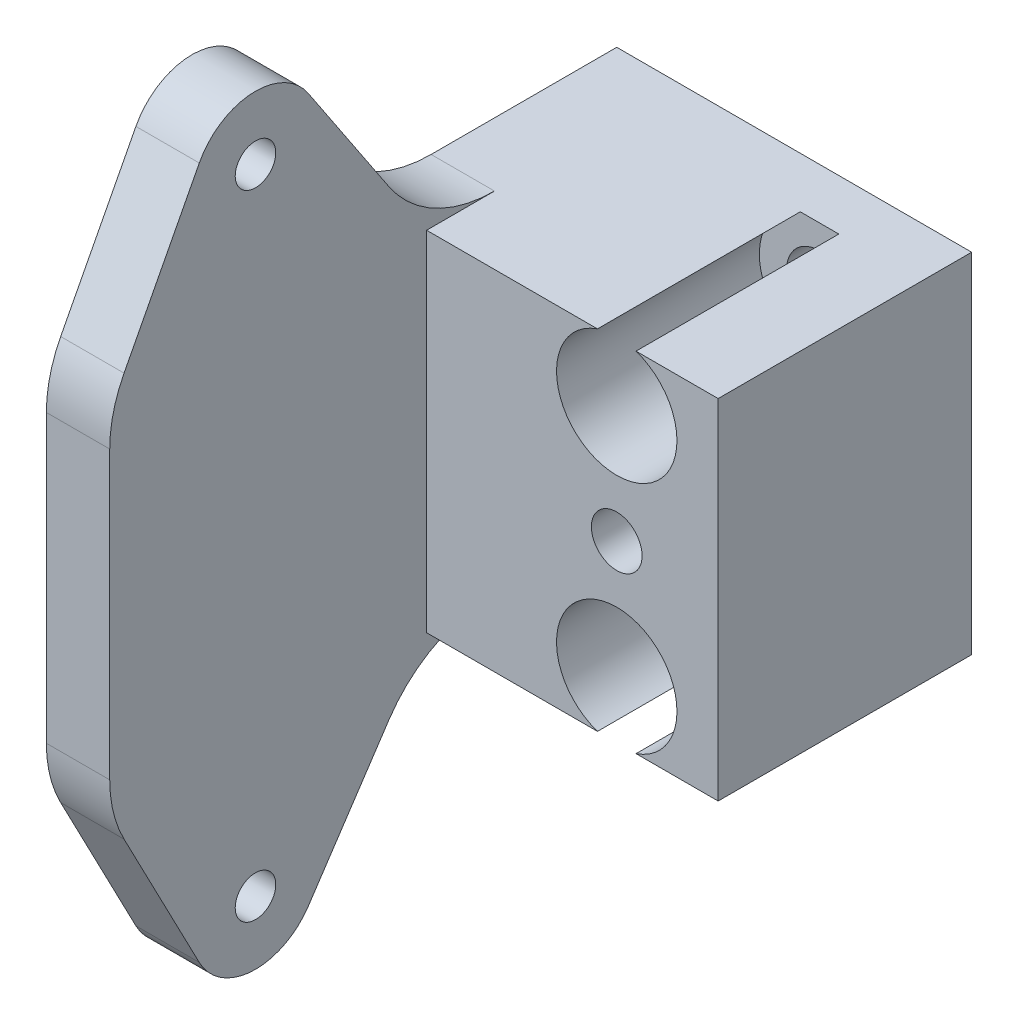
ISO-10303-21;
HEADER;
FILE_DESCRIPTION(('STEP AP214'),'2;1');
FILE_NAME('part.step','',(''),(''),'','','');
FILE_SCHEMA(('AUTOMOTIVE_DESIGN { 1 0 10303 214 1 1 1 1 }'));
ENDSEC;
DATA;
#1=APPLICATION_CONTEXT('core data for automotive mechanical design processes');
#2=APPLICATION_PROTOCOL_DEFINITION('international standard','automotive_design',2000,#1);
#3=PRODUCT_CONTEXT('',#1,'mechanical');
#4=PRODUCT('Part','Part','',(#3));
#5=PRODUCT_RELATED_PRODUCT_CATEGORY('part','',(#4));
#6=PRODUCT_DEFINITION_FORMATION('','',#4);
#7=PRODUCT_DEFINITION_CONTEXT('part definition',#1,'design');
#8=PRODUCT_DEFINITION('design','',#6,#7);
#9=PRODUCT_DEFINITION_SHAPE('','',#8);
#10=(LENGTH_UNIT() NAMED_UNIT(*) SI_UNIT(.MILLI.,.METRE.));
#11=(NAMED_UNIT(*) PLANE_ANGLE_UNIT() SI_UNIT($,.RADIAN.));
#12=(NAMED_UNIT(*) SI_UNIT($,.STERADIAN.) SOLID_ANGLE_UNIT());
#13=UNCERTAINTY_MEASURE_WITH_UNIT(LENGTH_MEASURE(1.E-05),#10,'distance_accuracy_value','');
#14=(GEOMETRIC_REPRESENTATION_CONTEXT(3) GLOBAL_UNCERTAINTY_ASSIGNED_CONTEXT((#13)) GLOBAL_UNIT_ASSIGNED_CONTEXT((#10,
#11,#12)) REPRESENTATION_CONTEXT('',''));
#15=CARTESIAN_POINT('',(0.,0.,0.));
#16=DIRECTION('',(0.,0.,1.));
#17=DIRECTION('',(1.,0.,0.));
#18=AXIS2_PLACEMENT_3D('',#15,#16,#17);
#19=CARTESIAN_POINT('',(0.,9.25,20.));
#20=DIRECTION('',(0.,0.,-1.));
#21=DIRECTION('',(-1.,0.,0.));
#22=AXIS2_PLACEMENT_3D('',#19,#20,#21);
#23=CYLINDRICAL_SURFACE('',#22,2.6);
#24=CARTESIAN_POINT('',(0.,9.25,0.));
#25=DIRECTION('',(0.,0.,1.));
#26=DIRECTION('',(1.,0.,0.));
#27=AXIS2_PLACEMENT_3D('',#24,#25,#26);
#28=CIRCLE('',#27,2.6);
#29=CARTESIAN_POINT('',(2.59999999999998,9.25,0.));
#30=VERTEX_POINT('',#29);
#31=EDGE_CURVE('E186',#30,#30,#28,.T.);
#32=ORIENTED_EDGE('',*,*,#31,.F.);
#33=EDGE_LOOP('',(#32));
#34=FACE_BOUND('',#33,.T.);
#35=CARTESIAN_POINT('',(0.,9.25,4.));
#36=DIRECTION('',(0.,0.,1.));
#37=DIRECTION('',(1.,0.,0.));
#38=AXIS2_PLACEMENT_3D('',#35,#36,#37);
#39=CIRCLE('',#38,2.6);
#40=CARTESIAN_POINT('',(2.59999999999998,9.25,4.));
#41=VERTEX_POINT('',#40);
#42=EDGE_CURVE('E263',#41,#41,#39,.T.);
#43=ORIENTED_EDGE('',*,*,#42,.T.);
#44=EDGE_LOOP('',(#43));
#45=FACE_BOUND('',#44,.T.);
#46=ADVANCED_FACE('F36',(#34,#45),#23,.F.);
#47=CARTESIAN_POINT('',(0.,-9.25,20.));
#48=DIRECTION('',(0.,0.,-1.));
#49=DIRECTION('',(-1.,0.,0.));
#50=AXIS2_PLACEMENT_3D('',#47,#48,#49);
#51=CYLINDRICAL_SURFACE('',#50,2.6);
#52=CARTESIAN_POINT('',(0.,-9.25,0.));
#53=DIRECTION('',(0.,0.,1.));
#54=DIRECTION('',(-1.,0.,0.));
#55=AXIS2_PLACEMENT_3D('',#52,#53,#54);
#56=CIRCLE('',#55,2.6);
#57=CARTESIAN_POINT('',(-2.60000000000002,-9.25,0.));
#58=VERTEX_POINT('',#57);
#59=EDGE_CURVE('E270',#58,#58,#56,.T.);
#60=ORIENTED_EDGE('',*,*,#59,.F.);
#61=EDGE_LOOP('',(#60));
#62=FACE_BOUND('',#61,.T.);
#63=CARTESIAN_POINT('',(0.,-9.25,4.));
#64=DIRECTION('',(0.,0.,1.));
#65=DIRECTION('',(1.,0.,0.));
#66=AXIS2_PLACEMENT_3D('',#63,#64,#65);
#67=CIRCLE('',#66,2.6);
#68=CARTESIAN_POINT('',(2.59999999999998,-9.25,4.));
#69=VERTEX_POINT('',#68);
#70=EDGE_CURVE('E255',#69,#69,#67,.T.);
#71=ORIENTED_EDGE('',*,*,#70,.T.);
#72=EDGE_LOOP('',(#71));
#73=FACE_BOUND('',#72,.T.);
#74=ADVANCED_FACE('F396',(#62,#73),#51,.F.);
#75=CARTESIAN_POINT('',(0.,0.,20.));
#76=DIRECTION('',(0.,0.,1.));
#77=DIRECTION('',(1.,0.,0.));
#78=AXIS2_PLACEMENT_3D('',#75,#76,#77);
#79=PLANE('',#78);
#80=CARTESIAN_POINT('',(0.,9.25,20.));
#81=DIRECTION('',(0.,0.,1.));
#82=DIRECTION('',(1.,0.,0.));
#83=AXIS2_PLACEMENT_3D('',#80,#81,#82);
#84=CIRCLE('',#83,4.75);
#85=CARTESIAN_POINT('',(-1.52069063257457,13.75,20.));
#86=VERTEX_POINT('',#85);
#87=CARTESIAN_POINT('',(1.52069063257452,13.75,20.));
#88=VERTEX_POINT('',#87);
#89=EDGE_CURVE('E256',#86,#88,#84,.T.);
#90=ORIENTED_EDGE('',*,*,#89,.F.);
#91=DIRECTION('',(-1.,0.,0.));
#92=VECTOR('',#91,1.);
#93=CARTESIAN_POINT('',(8.,13.75,20.));
#94=LINE('',#93,#92);
#95=CARTESIAN_POINT('',(-15.,13.75,20.));
#96=VERTEX_POINT('',#95);
#97=EDGE_CURVE('E287',#86,#96,#94,.T.);
#98=ORIENTED_EDGE('',*,*,#97,.T.);
#99=DIRECTION('',(0.,-1.,0.));
#100=VECTOR('',#99,1.);
#101=CARTESIAN_POINT('',(-15.,-13.75,20.));
#102=LINE('',#101,#100);
#103=CARTESIAN_POINT('',(-15.,-13.75,20.));
#104=VERTEX_POINT('',#103);
#105=EDGE_CURVE('E277',#96,#104,#102,.T.);
#106=ORIENTED_EDGE('',*,*,#105,.T.);
#107=DIRECTION('',(1.,0.,0.));
#108=VECTOR('',#107,1.);
#109=CARTESIAN_POINT('',(8.,-13.75,20.));
#110=LINE('',#109,#108);
#111=CARTESIAN_POINT('',(-1.52069063257458,-13.75,20.));
#112=VERTEX_POINT('',#111);
#113=EDGE_CURVE('E282',#104,#112,#110,.T.);
#114=ORIENTED_EDGE('',*,*,#113,.T.);
#115=CARTESIAN_POINT('',(0.,-9.25,20.));
#116=DIRECTION('',(0.,0.,1.));
#117=DIRECTION('',(1.,0.,0.));
#118=AXIS2_PLACEMENT_3D('',#115,#116,#117);
#119=CIRCLE('',#118,4.75);
#120=CARTESIAN_POINT('',(1.52069063257454,-13.75,20.));
#121=VERTEX_POINT('',#120);
#122=EDGE_CURVE('E252',#121,#112,#119,.T.);
#123=ORIENTED_EDGE('',*,*,#122,.F.);
#124=CARTESIAN_POINT('',(8.,-13.75,20.));
#125=VERTEX_POINT('',#124);
#126=EDGE_CURVE('E280',#121,#125,#110,.T.);
#127=ORIENTED_EDGE('',*,*,#126,.T.);
#128=DIRECTION('',(0.,1.,0.));
#129=VECTOR('',#128,1.);
#130=CARTESIAN_POINT('',(8.,13.75,20.));
#131=LINE('',#130,#129);
#132=CARTESIAN_POINT('',(8.,13.75,20.));
#133=VERTEX_POINT('',#132);
#134=EDGE_CURVE('E285',#125,#133,#131,.T.);
#135=ORIENTED_EDGE('',*,*,#134,.T.);
#136=EDGE_CURVE('E288',#133,#88,#94,.T.);
#137=ORIENTED_EDGE('',*,*,#136,.T.);
#138=EDGE_LOOP('',(#90,#98,#106,#114,#123,#127,#135,#137));
#139=FACE_BOUND('',#138,.T.);
#140=CARTESIAN_POINT('',(0.,0.,20.));
#141=DIRECTION('',(0.,0.,1.));
#142=DIRECTION('',(1.,0.,0.));
#143=AXIS2_PLACEMENT_3D('',#140,#141,#142);
#144=CIRCLE('',#143,2.);
#145=CARTESIAN_POINT('',(2.,0.,20.));
#146=VERTEX_POINT('',#145);
#147=EDGE_CURVE('E267',#146,#146,#144,.T.);
#148=ORIENTED_EDGE('',*,*,#147,.F.);
#149=EDGE_LOOP('',(#148));
#150=FACE_BOUND('',#149,.T.);
#151=ADVANCED_FACE('F373',(#139,#150),#79,.T.);
#152=CARTESIAN_POINT('',(0.,0.,0.));
#153=DIRECTION('',(0.,0.,1.));
#154=DIRECTION('',(1.,0.,0.));
#155=AXIS2_PLACEMENT_3D('',#152,#153,#154);
#156=PLANE('',#155);
#157=DIRECTION('',(1.,0.,0.));
#158=VECTOR('',#157,1.);
#159=CARTESIAN_POINT('',(8.,-13.75,0.));
#160=LINE('',#159,#158);
#161=CARTESIAN_POINT('',(-20.,-13.75,0.));
#162=VERTEX_POINT('',#161);
#163=CARTESIAN_POINT('',(8.,-13.75,0.));
#164=VERTEX_POINT('',#163);
#165=EDGE_CURVE('E175',#162,#164,#160,.T.);
#166=ORIENTED_EDGE('',*,*,#165,.F.);
#167=DIRECTION('',(0.,-1.,0.));
#168=VECTOR('',#167,1.);
#169=CARTESIAN_POINT('',(-20.,13.75,0.));
#170=LINE('',#169,#168);
#171=CARTESIAN_POINT('',(-20.,13.75,0.));
#172=VERTEX_POINT('',#171);
#173=EDGE_CURVE('E181',#172,#162,#170,.T.);
#174=ORIENTED_EDGE('',*,*,#173,.F.);
#175=DIRECTION('',(-1.,0.,0.));
#176=VECTOR('',#175,1.);
#177=CARTESIAN_POINT('',(8.,13.75,0.));
#178=LINE('',#177,#176);
#179=CARTESIAN_POINT('',(8.,13.75,0.));
#180=VERTEX_POINT('',#179);
#181=EDGE_CURVE('E281',#180,#172,#178,.T.);
#182=ORIENTED_EDGE('',*,*,#181,.F.);
#183=DIRECTION('',(0.,1.,0.));
#184=VECTOR('',#183,1.);
#185=CARTESIAN_POINT('',(8.,13.75,0.));
#186=LINE('',#185,#184);
#187=EDGE_CURVE('E182',#164,#180,#186,.T.);
#188=ORIENTED_EDGE('',*,*,#187,.F.);
#189=EDGE_LOOP('',(#166,#174,#182,#188));
#190=FACE_BOUND('',#189,.T.);
#191=ORIENTED_EDGE('',*,*,#31,.T.);
#192=EDGE_LOOP('',(#191));
#193=FACE_BOUND('',#192,.T.);
#194=ORIENTED_EDGE('',*,*,#59,.T.);
#195=EDGE_LOOP('',(#194));
#196=FACE_BOUND('',#195,.T.);
#197=CARTESIAN_POINT('',(0.,0.,0.));
#198=DIRECTION('',(0.,0.,1.));
#199=DIRECTION('',(1.,0.,0.));
#200=AXIS2_PLACEMENT_3D('',#197,#198,#199);
#201=CIRCLE('',#200,2.);
#202=CARTESIAN_POINT('',(2.,0.,0.));
#203=VERTEX_POINT('',#202);
#204=EDGE_CURVE('E266',#203,#203,#201,.T.);
#205=ORIENTED_EDGE('',*,*,#204,.T.);
#206=EDGE_LOOP('',(#205));
#207=FACE_BOUND('',#206,.T.);
#208=ADVANCED_FACE('F177',(#190,#193,#196,#207),#156,.F.);
#209=CARTESIAN_POINT('',(8.,-13.75,20.));
#210=DIRECTION('',(0.,1.,0.));
#211=DIRECTION('',(0.,0.,1.));
#212=AXIS2_PLACEMENT_3D('',#209,#210,#211);
#213=PLANE('',#212);
#214=ORIENTED_EDGE('',*,*,#113,.F.);
#215=DIRECTION('',(0.,0.,-1.));
#216=VECTOR('',#215,1.);
#217=CARTESIAN_POINT('',(-15.,-13.75,33.5));
#218=LINE('',#217,#216);
#219=CARTESIAN_POINT('',(-15.,-13.75,14.6452230578697));
#220=VERTEX_POINT('',#219);
#221=EDGE_CURVE('E51',#104,#220,#218,.T.);
#222=ORIENTED_EDGE('',*,*,#221,.T.);
#223=DIRECTION('',(1.,0.,0.));
#224=VECTOR('',#223,1.);
#225=CARTESIAN_POINT('',(-20.,-13.75,14.6452230578697));
#226=LINE('',#225,#224);
#227=CARTESIAN_POINT('',(-20.,-13.75,14.6452230578697));
#228=VERTEX_POINT('',#227);
#229=EDGE_CURVE('E192',#220,#228,#226,.F.);
#230=ORIENTED_EDGE('',*,*,#229,.T.);
#231=DIRECTION('',(0.,0.,1.));
#232=VECTOR('',#231,1.);
#233=CARTESIAN_POINT('',(-20.,-13.75,20.));
#234=LINE('',#233,#232);
#235=EDGE_CURVE('E189',#162,#228,#234,.T.);
#236=ORIENTED_EDGE('',*,*,#235,.F.);
#237=ORIENTED_EDGE('',*,*,#165,.T.);
#238=DIRECTION('',(0.,0.,-1.));
#239=VECTOR('',#238,1.);
#240=CARTESIAN_POINT('',(8.,-13.75,20.));
#241=LINE('',#240,#239);
#242=EDGE_CURVE('E296',#125,#164,#241,.T.);
#243=ORIENTED_EDGE('',*,*,#242,.F.);
#244=ORIENTED_EDGE('',*,*,#126,.F.);
#245=DIRECTION('',(0.,0.,1.));
#246=VECTOR('',#245,1.);
#247=CARTESIAN_POINT('',(1.52069063257454,-13.75,4.));
#248=LINE('',#247,#246);
#249=CARTESIAN_POINT('',(1.52069063257454,-13.75,4.));
#250=VERTEX_POINT('',#249);
#251=EDGE_CURVE('E308',#121,#250,#248,.F.);
#252=ORIENTED_EDGE('',*,*,#251,.T.);
#253=DIRECTION('',(1.,0.,0.));
#254=VECTOR('',#253,1.);
#255=CARTESIAN_POINT('',(8.,-13.75,4.));
#256=LINE('',#255,#254);
#257=CARTESIAN_POINT('',(-1.52069063257458,-13.75,4.));
#258=VERTEX_POINT('',#257);
#259=EDGE_CURVE('E261',#258,#250,#256,.T.);
#260=ORIENTED_EDGE('',*,*,#259,.F.);
#261=DIRECTION('',(0.,0.,1.));
#262=VECTOR('',#261,1.);
#263=CARTESIAN_POINT('',(-1.52069063257458,-13.75,4.));
#264=LINE('',#263,#262);
#265=EDGE_CURVE('E311',#258,#112,#264,.T.);
#266=ORIENTED_EDGE('',*,*,#265,.T.);
#267=EDGE_LOOP('',(#214,#222,#230,#236,#237,#243,#244,#252,#260,#266));
#268=FACE_BOUND('',#267,.T.);
#269=ADVANCED_FACE('F190',(#268),#213,.F.);
#270=CARTESIAN_POINT('',(8.,13.75,20.));
#271=DIRECTION('',(-1.,0.,0.));
#272=DIRECTION('',(0.,-1.,0.));
#273=AXIS2_PLACEMENT_3D('',#270,#271,#272);
#274=PLANE('',#273);
#275=ORIENTED_EDGE('',*,*,#187,.T.);
#276=DIRECTION('',(0.,0.,-1.));
#277=VECTOR('',#276,1.);
#278=CARTESIAN_POINT('',(8.,13.75,20.));
#279=LINE('',#278,#277);
#280=EDGE_CURVE('E290',#133,#180,#279,.T.);
#281=ORIENTED_EDGE('',*,*,#280,.F.);
#282=ORIENTED_EDGE('',*,*,#134,.F.);
#283=ORIENTED_EDGE('',*,*,#242,.T.);
#284=EDGE_LOOP('',(#275,#281,#282,#283));
#285=FACE_BOUND('',#284,.T.);
#286=ADVANCED_FACE('F367',(#285),#274,.F.);
#287=CARTESIAN_POINT('',(8.,13.75,20.));
#288=DIRECTION('',(0.,-1.,0.));
#289=DIRECTION('',(1.,0.,0.));
#290=AXIS2_PLACEMENT_3D('',#287,#288,#289);
#291=PLANE('',#290);
#292=DIRECTION('',(0.,0.,-1.));
#293=VECTOR('',#292,1.);
#294=CARTESIAN_POINT('',(-20.,13.75,0.));
#295=LINE('',#294,#293);
#296=CARTESIAN_POINT('',(-20.,13.75,14.6452230578697));
#297=VERTEX_POINT('',#296);
#298=EDGE_CURVE('E201',#297,#172,#295,.T.);
#299=ORIENTED_EDGE('',*,*,#298,.F.);
#300=DIRECTION('',(1.,0.,0.));
#301=VECTOR('',#300,1.);
#302=CARTESIAN_POINT('',(-15.,13.75,14.6452230578697));
#303=LINE('',#302,#301);
#304=CARTESIAN_POINT('',(-15.,13.75,14.6452230578697));
#305=VERTEX_POINT('',#304);
#306=EDGE_CURVE('E321',#297,#305,#303,.T.);
#307=ORIENTED_EDGE('',*,*,#306,.T.);
#308=DIRECTION('',(0.,0.,1.));
#309=VECTOR('',#308,1.);
#310=CARTESIAN_POINT('',(-15.,13.75,33.5));
#311=LINE('',#310,#309);
#312=EDGE_CURVE('E319',#305,#96,#311,.T.);
#313=ORIENTED_EDGE('',*,*,#312,.T.);
#314=ORIENTED_EDGE('',*,*,#97,.F.);
#315=DIRECTION('',(0.,0.,1.));
#316=VECTOR('',#315,1.);
#317=CARTESIAN_POINT('',(-1.52069063257457,13.75,4.));
#318=LINE('',#317,#316);
#319=CARTESIAN_POINT('',(-1.52069063257457,13.75,4.));
#320=VERTEX_POINT('',#319);
#321=EDGE_CURVE('E298',#86,#320,#318,.F.);
#322=ORIENTED_EDGE('',*,*,#321,.T.);
#323=DIRECTION('',(-1.,0.,0.));
#324=VECTOR('',#323,1.);
#325=CARTESIAN_POINT('',(8.,13.75,4.));
#326=LINE('',#325,#324);
#327=CARTESIAN_POINT('',(1.52069063257452,13.75,4.));
#328=VERTEX_POINT('',#327);
#329=EDGE_CURVE('E264',#328,#320,#326,.T.);
#330=ORIENTED_EDGE('',*,*,#329,.F.);
#331=DIRECTION('',(0.,0.,1.));
#332=VECTOR('',#331,1.);
#333=CARTESIAN_POINT('',(1.52069063257453,13.75,4.));
#334=LINE('',#333,#332);
#335=EDGE_CURVE('E305',#328,#88,#334,.T.);
#336=ORIENTED_EDGE('',*,*,#335,.T.);
#337=ORIENTED_EDGE('',*,*,#136,.F.);
#338=ORIENTED_EDGE('',*,*,#280,.T.);
#339=ORIENTED_EDGE('',*,*,#181,.T.);
#340=EDGE_LOOP('',(#299,#307,#313,#314,#322,#330,#336,#337,#338,#339));
#341=FACE_BOUND('',#340,.T.);
#342=ADVANCED_FACE('F362',(#341),#291,.F.);
#343=CARTESIAN_POINT('',(0.,0.,20.));
#344=DIRECTION('',(0.,0.,-1.));
#345=DIRECTION('',(-1.,0.,0.));
#346=AXIS2_PLACEMENT_3D('',#343,#344,#345);
#347=CYLINDRICAL_SURFACE('',#346,2.);
#348=ORIENTED_EDGE('',*,*,#147,.T.);
#349=EDGE_LOOP('',(#348));
#350=FACE_BOUND('',#349,.T.);
#351=ORIENTED_EDGE('',*,*,#204,.F.);
#352=EDGE_LOOP('',(#351));
#353=FACE_BOUND('',#352,.T.);
#354=ADVANCED_FACE('F392',(#350,#353),#347,.F.);
#355=CARTESIAN_POINT('',(0.,-9.25,4.));
#356=DIRECTION('',(0.,0.,1.));
#357=DIRECTION('',(1.,0.,0.));
#358=AXIS2_PLACEMENT_3D('',#355,#356,#357);
#359=CYLINDRICAL_SURFACE('',#358,4.75);
#360=CARTESIAN_POINT('',(0.,-9.25,4.));
#361=DIRECTION('',(0.,0.,1.));
#362=DIRECTION('',(1.,0.,0.));
#363=AXIS2_PLACEMENT_3D('',#360,#361,#362);
#364=CIRCLE('',#363,4.75);
#365=EDGE_CURVE('E258',#250,#258,#364,.T.);
#366=ORIENTED_EDGE('',*,*,#365,.F.);
#367=ORIENTED_EDGE('',*,*,#251,.F.);
#368=ORIENTED_EDGE('',*,*,#122,.T.);
#369=ORIENTED_EDGE('',*,*,#265,.F.);
#370=EDGE_LOOP('',(#366,#367,#368,#369));
#371=FACE_BOUND('',#370,.T.);
#372=ADVANCED_FACE('F378',(#371),#359,.F.);
#373=CARTESIAN_POINT('',(0.,-9.25,4.));
#374=DIRECTION('',(0.,0.,1.));
#375=DIRECTION('',(1.,0.,0.));
#376=AXIS2_PLACEMENT_3D('',#373,#374,#375);
#377=PLANE('',#376);
#378=ORIENTED_EDGE('',*,*,#70,.F.);
#379=EDGE_LOOP('',(#378));
#380=FACE_BOUND('',#379,.T.);
#381=ORIENTED_EDGE('',*,*,#259,.T.);
#382=ORIENTED_EDGE('',*,*,#365,.T.);
#383=EDGE_LOOP('',(#381,#382));
#384=FACE_BOUND('',#383,.T.);
#385=ADVANCED_FACE('F380',(#380,#384),#377,.T.);
#386=CARTESIAN_POINT('',(0.,9.25,4.));
#387=DIRECTION('',(0.,0.,1.));
#388=DIRECTION('',(1.,0.,0.));
#389=AXIS2_PLACEMENT_3D('',#386,#387,#388);
#390=CYLINDRICAL_SURFACE('',#389,4.75);
#391=CARTESIAN_POINT('',(0.,9.25,4.));
#392=DIRECTION('',(0.,0.,1.));
#393=DIRECTION('',(1.,0.,0.));
#394=AXIS2_PLACEMENT_3D('',#391,#392,#393);
#395=CIRCLE('',#394,4.75);
#396=EDGE_CURVE('E253',#320,#328,#395,.T.);
#397=ORIENTED_EDGE('',*,*,#396,.F.);
#398=ORIENTED_EDGE('',*,*,#321,.F.);
#399=ORIENTED_EDGE('',*,*,#89,.T.);
#400=ORIENTED_EDGE('',*,*,#335,.F.);
#401=EDGE_LOOP('',(#397,#398,#399,#400));
#402=FACE_BOUND('',#401,.T.);
#403=ADVANCED_FACE('F382',(#402),#390,.F.);
#404=CARTESIAN_POINT('',(0.,9.25,4.));
#405=DIRECTION('',(0.,0.,1.));
#406=DIRECTION('',(1.,0.,0.));
#407=AXIS2_PLACEMENT_3D('',#404,#405,#406);
#408=PLANE('',#407);
#409=ORIENTED_EDGE('',*,*,#42,.F.);
#410=EDGE_LOOP('',(#409));
#411=FACE_BOUND('',#410,.T.);
#412=ORIENTED_EDGE('',*,*,#329,.T.);
#413=ORIENTED_EDGE('',*,*,#396,.T.);
#414=EDGE_LOOP('',(#412,#413));
#415=FACE_BOUND('',#414,.T.);
#416=ADVANCED_FACE('F389',(#411,#415),#408,.T.);
#417=CARTESIAN_POINT('',(-20.,-25.,33.5));
#418=DIRECTION('',(-1.,0.,0.));
#419=DIRECTION('',(0.,0.,1.));
#420=AXIS2_PLACEMENT_3D('',#417,#418,#419);
#421=PLANE('',#420);
#422=CARTESIAN_POINT('',(-20.,25.,33.5));
#423=DIRECTION('',(-1.,0.,0.));
#424=DIRECTION('',(0.,0.,1.));
#425=AXIS2_PLACEMENT_3D('',#422,#423,#424);
#426=CIRCLE('',#425,1.6);
#427=CARTESIAN_POINT('',(-20.,25.,35.1));
#428=VERTEX_POINT('',#427);
#429=EDGE_CURVE('E231',#428,#428,#426,.T.);
#430=ORIENTED_EDGE('',*,*,#429,.F.);
#431=EDGE_LOOP('',(#430));
#432=FACE_BOUND('',#431,.T.);
#433=DIRECTION('',(0.,1.,0.));
#434=VECTOR('',#433,1.);
#435=CARTESIAN_POINT('',(-20.,13.75,45.));
#436=LINE('',#435,#434);
#437=CARTESIAN_POINT('',(-20.,-11.3009523131073,45.));
#438=VERTEX_POINT('',#437);
#439=CARTESIAN_POINT('',(-20.,11.3009523131073,45.));
#440=VERTEX_POINT('',#439);
#441=EDGE_CURVE('E217',#438,#440,#436,.T.);
#442=ORIENTED_EDGE('',*,*,#441,.T.);
#443=CARTESIAN_POINT('',(-20.,11.3009523131073,35.));
#444=DIRECTION('',(-1.,0.,0.));
#445=DIRECTION('',(0.,0.,1.));
#446=AXIS2_PLACEMENT_3D('',#443,#444,#445);
#447=CIRCLE('',#446,10.);
#448=CARTESIAN_POINT('',(-20.,15.9218914044877,43.8683099806982));
#449=VERTEX_POINT('',#448);
#450=EDGE_CURVE('E340',#440,#449,#447,.T.);
#451=ORIENTED_EDGE('',*,*,#450,.T.);
#452=DIRECTION('',(0.,0.886830998069825,-0.462093909138042));
#453=VECTOR('',#452,1.);
#454=CARTESIAN_POINT('',(-20.,27.3104695456902,37.9341549903491));
#455=LINE('',#454,#453);
#456=CARTESIAN_POINT('',(-20.,27.3104695456902,37.9341549903491));
#457=VERTEX_POINT('',#456);
#458=EDGE_CURVE('E219',#449,#457,#455,.T.);
#459=ORIENTED_EDGE('',*,*,#458,.T.);
#460=CARTESIAN_POINT('',(-20.,25.,33.5));
#461=DIRECTION('',(-1.,0.,0.));
#462=DIRECTION('',(0.,0.,-1.));
#463=AXIS2_PLACEMENT_3D('',#460,#461,#462);
#464=CIRCLE('',#463,5.00000000000001);
#465=CARTESIAN_POINT('',(-20.,27.7715997644076,29.3384816778085));
#466=VERTEX_POINT('',#465);
#467=EDGE_CURVE('E221',#457,#466,#464,.T.);
#468=ORIENTED_EDGE('',*,*,#467,.T.);
#469=DIRECTION('',(0.,-0.832303664438304,-0.55431995288152));
#470=VECTOR('',#469,1.);
#471=CARTESIAN_POINT('',(-20.,13.75,20.));
#472=LINE('',#471,#470);
#473=CARTESIAN_POINT('',(-20.,18.2068004711848,22.9682597022527));
#474=VERTEX_POINT('',#473);
#475=EDGE_CURVE('E223',#466,#474,#472,.T.);
#476=ORIENTED_EDGE('',*,*,#475,.T.);
#477=CARTESIAN_POINT('',(-20.,23.75,14.6452230578697));
#478=DIRECTION('',(-1.,0.,0.));
#479=DIRECTION('',(0.,0.,1.));
#480=AXIS2_PLACEMENT_3D('',#477,#478,#479);
#481=CIRCLE('',#480,10.);
#482=EDGE_CURVE('E11',#474,#297,#481,.F.);
#483=ORIENTED_EDGE('',*,*,#482,.T.);
#484=ORIENTED_EDGE('',*,*,#298,.T.);
#485=ORIENTED_EDGE('',*,*,#173,.T.);
#486=ORIENTED_EDGE('',*,*,#235,.T.);
#487=CARTESIAN_POINT('',(-20.,-23.75,14.6452230578697));
#488=DIRECTION('',(-1.,0.,0.));
#489=DIRECTION('',(0.,0.,1.));
#490=AXIS2_PLACEMENT_3D('',#487,#488,#489);
#491=CIRCLE('',#490,10.);
#492=CARTESIAN_POINT('',(-20.,-18.2068004711848,22.9682597022527));
#493=VERTEX_POINT('',#492);
#494=EDGE_CURVE('E345',#228,#493,#491,.F.);
#495=ORIENTED_EDGE('',*,*,#494,.T.);
#496=DIRECTION('',(0.,-0.832303664438304,0.55431995288152));
#497=VECTOR('',#496,1.);
#498=CARTESIAN_POINT('',(-20.,-13.75,20.));
#499=LINE('',#498,#497);
#500=CARTESIAN_POINT('',(-20.,-27.7715997644076,29.3384816778085));
#501=VERTEX_POINT('',#500);
#502=EDGE_CURVE('E195',#493,#501,#499,.T.);
#503=ORIENTED_EDGE('',*,*,#502,.T.);
#504=CARTESIAN_POINT('',(-20.,-25.,33.5));
#505=DIRECTION('',(-1.,0.,0.));
#506=DIRECTION('',(0.,0.,1.));
#507=AXIS2_PLACEMENT_3D('',#504,#505,#506);
#508=CIRCLE('',#507,5.00000000000001);
#509=CARTESIAN_POINT('',(-20.,-27.3104695456902,37.9341549903491));
#510=VERTEX_POINT('',#509);
#511=EDGE_CURVE('E213',#501,#510,#508,.T.);
#512=ORIENTED_EDGE('',*,*,#511,.T.);
#513=DIRECTION('',(0.,0.886830998069825,0.462093909138042));
#514=VECTOR('',#513,1.);
#515=CARTESIAN_POINT('',(-20.,-27.3104695456902,37.9341549903491));
#516=LINE('',#515,#514);
#517=CARTESIAN_POINT('',(-20.,-15.9218914044877,43.8683099806982));
#518=VERTEX_POINT('',#517);
#519=EDGE_CURVE('E215',#510,#518,#516,.T.);
#520=ORIENTED_EDGE('',*,*,#519,.T.);
#521=CARTESIAN_POINT('',(-20.,-11.3009523131073,35.));
#522=DIRECTION('',(-1.,0.,0.));
#523=DIRECTION('',(0.,0.,1.));
#524=AXIS2_PLACEMENT_3D('',#521,#522,#523);
#525=CIRCLE('',#524,10.);
#526=EDGE_CURVE('E338',#518,#438,#525,.T.);
#527=ORIENTED_EDGE('',*,*,#526,.T.);
#528=EDGE_LOOP('',(#442,#451,#459,#468,#476,#483,#484,#485,#486,#495,#503,#512,#520,#527));
#529=FACE_BOUND('',#528,.T.);
#530=CARTESIAN_POINT('',(-20.,-25.,33.5));
#531=DIRECTION('',(-1.,0.,0.));
#532=DIRECTION('',(0.,0.,1.));
#533=AXIS2_PLACEMENT_3D('',#530,#531,#532);
#534=CIRCLE('',#533,1.6);
#535=CARTESIAN_POINT('',(-20.,-25.,35.1));
#536=VERTEX_POINT('',#535);
#537=EDGE_CURVE('E673',#536,#536,#534,.T.);
#538=ORIENTED_EDGE('',*,*,#537,.F.);
#539=EDGE_LOOP('',(#538));
#540=FACE_BOUND('',#539,.T.);
#541=ADVANCED_FACE('F198',(#432,#529,#540),#421,.T.);
#542=CARTESIAN_POINT('',(-15.,-25.,33.5));
#543=DIRECTION('',(-1.,0.,0.));
#544=DIRECTION('',(0.,0.,1.));
#545=AXIS2_PLACEMENT_3D('',#542,#543,#544);
#546=PLANE('',#545);
#547=DIRECTION('',(0.,0.886830998069825,-0.462093909138042));
#548=VECTOR('',#547,1.);
#549=CARTESIAN_POINT('',(-15.,27.3104695456902,37.9341549903491));
#550=LINE('',#549,#548);
#551=CARTESIAN_POINT('',(-15.,15.9218914044877,43.8683099806982));
#552=VERTEX_POINT('',#551);
#553=CARTESIAN_POINT('',(-15.,27.3104695456902,37.9341549903491));
#554=VERTEX_POINT('',#553);
#555=EDGE_CURVE('E238',#552,#554,#550,.T.);
#556=ORIENTED_EDGE('',*,*,#555,.F.);
#557=CARTESIAN_POINT('',(-15.,11.3009523131073,35.));
#558=DIRECTION('',(-1.,0.,0.));
#559=DIRECTION('',(0.,0.,1.));
#560=AXIS2_PLACEMENT_3D('',#557,#558,#559);
#561=CIRCLE('',#560,10.);
#562=CARTESIAN_POINT('',(-15.,11.3009523131073,45.));
#563=VERTEX_POINT('',#562);
#564=EDGE_CURVE('E331',#552,#563,#561,.F.);
#565=ORIENTED_EDGE('',*,*,#564,.T.);
#566=DIRECTION('',(0.,1.,0.));
#567=VECTOR('',#566,1.);
#568=CARTESIAN_POINT('',(-15.,13.75,45.));
#569=LINE('',#568,#567);
#570=CARTESIAN_POINT('',(-15.,-11.3009523131073,45.));
#571=VERTEX_POINT('',#570);
#572=EDGE_CURVE('E235',#571,#563,#569,.T.);
#573=ORIENTED_EDGE('',*,*,#572,.F.);
#574=CARTESIAN_POINT('',(-15.,-11.3009523131073,35.));
#575=DIRECTION('',(-1.,0.,0.));
#576=DIRECTION('',(0.,0.,1.));
#577=AXIS2_PLACEMENT_3D('',#574,#575,#576);
#578=CIRCLE('',#577,10.);
#579=CARTESIAN_POINT('',(-15.,-15.9218914044877,43.8683099806982));
#580=VERTEX_POINT('',#579);
#581=EDGE_CURVE('E329',#571,#580,#578,.F.);
#582=ORIENTED_EDGE('',*,*,#581,.T.);
#583=DIRECTION('',(0.,0.886830998069825,0.462093909138042));
#584=VECTOR('',#583,1.);
#585=CARTESIAN_POINT('',(-15.,-27.3104695456902,37.9341549903491));
#586=LINE('',#585,#584);
#587=CARTESIAN_POINT('',(-15.,-27.3104695456902,37.9341549903491));
#588=VERTEX_POINT('',#587);
#589=EDGE_CURVE('E233',#588,#580,#586,.T.);
#590=ORIENTED_EDGE('',*,*,#589,.F.);
#591=CARTESIAN_POINT('',(-15.,-25.,33.5));
#592=DIRECTION('',(-1.,0.,0.));
#593=DIRECTION('',(0.,0.,1.));
#594=AXIS2_PLACEMENT_3D('',#591,#592,#593);
#595=CIRCLE('',#594,5.00000000000001);
#596=CARTESIAN_POINT('',(-15.,-27.7715997644076,29.3384816778085));
#597=VERTEX_POINT('',#596);
#598=EDGE_CURVE('E230',#597,#588,#595,.T.);
#599=ORIENTED_EDGE('',*,*,#598,.F.);
#600=DIRECTION('',(0.,-0.832303664438304,0.55431995288152));
#601=VECTOR('',#600,1.);
#602=CARTESIAN_POINT('',(-15.,-13.75,20.));
#603=LINE('',#602,#601);
#604=CARTESIAN_POINT('',(-15.,-18.2068004711848,22.9682597022527));
#605=VERTEX_POINT('',#604);
#606=EDGE_CURVE('E228',#605,#597,#603,.T.);
#607=ORIENTED_EDGE('',*,*,#606,.F.);
#608=CARTESIAN_POINT('',(-15.,-23.75,14.6452230578697));
#609=DIRECTION('',(-1.,0.,0.));
#610=DIRECTION('',(0.,0.,1.));
#611=AXIS2_PLACEMENT_3D('',#608,#609,#610);
#612=CIRCLE('',#611,10.);
#613=EDGE_CURVE('E343',#605,#220,#612,.T.);
#614=ORIENTED_EDGE('',*,*,#613,.T.);
#615=ORIENTED_EDGE('',*,*,#221,.F.);
#616=ORIENTED_EDGE('',*,*,#105,.F.);
#617=ORIENTED_EDGE('',*,*,#312,.F.);
#618=CARTESIAN_POINT('',(-15.,23.75,14.6452230578697));
#619=DIRECTION('',(-1.,0.,0.));
#620=DIRECTION('',(0.,0.,1.));
#621=AXIS2_PLACEMENT_3D('',#618,#619,#620);
#622=CIRCLE('',#621,10.);
#623=CARTESIAN_POINT('',(-15.,18.2068004711848,22.9682597022527));
#624=VERTEX_POINT('',#623);
#625=EDGE_CURVE('E44',#305,#624,#622,.T.);
#626=ORIENTED_EDGE('',*,*,#625,.T.);
#627=DIRECTION('',(0.,-0.832303664438304,-0.55431995288152));
#628=VECTOR('',#627,1.);
#629=CARTESIAN_POINT('',(-15.,13.75,20.));
#630=LINE('',#629,#628);
#631=CARTESIAN_POINT('',(-15.,27.7715997644076,29.3384816778085));
#632=VERTEX_POINT('',#631);
#633=EDGE_CURVE('E203',#632,#624,#630,.T.);
#634=ORIENTED_EDGE('',*,*,#633,.F.);
#635=CARTESIAN_POINT('',(-15.,25.,33.5));
#636=DIRECTION('',(-1.,0.,0.));
#637=DIRECTION('',(0.,0.,-1.));
#638=AXIS2_PLACEMENT_3D('',#635,#636,#637);
#639=CIRCLE('',#638,5.00000000000001);
#640=EDGE_CURVE('E206',#554,#632,#639,.T.);
#641=ORIENTED_EDGE('',*,*,#640,.F.);
#642=EDGE_LOOP('',(#556,#565,#573,#582,#590,#599,#607,#614,#615,#616,#617,#626,#634,#641));
#643=FACE_BOUND('',#642,.T.);
#644=CARTESIAN_POINT('',(-15.,25.,33.5));
#645=DIRECTION('',(-1.,0.,0.));
#646=DIRECTION('',(0.,0.,1.));
#647=AXIS2_PLACEMENT_3D('',#644,#645,#646);
#648=CIRCLE('',#647,1.6);
#649=CARTESIAN_POINT('',(-15.,25.,35.1));
#650=VERTEX_POINT('',#649);
#651=EDGE_CURVE('E209',#650,#650,#648,.T.);
#652=ORIENTED_EDGE('',*,*,#651,.T.);
#653=EDGE_LOOP('',(#652));
#654=FACE_BOUND('',#653,.T.);
#655=CARTESIAN_POINT('',(-15.,-25.,33.5));
#656=DIRECTION('',(-1.,0.,0.));
#657=DIRECTION('',(0.,0.,1.));
#658=AXIS2_PLACEMENT_3D('',#655,#656,#657);
#659=CIRCLE('',#658,1.6);
#660=CARTESIAN_POINT('',(-15.,-25.,35.1));
#661=VERTEX_POINT('',#660);
#662=EDGE_CURVE('E676',#661,#661,#659,.T.);
#663=ORIENTED_EDGE('',*,*,#662,.T.);
#664=EDGE_LOOP('',(#663));
#665=FACE_BOUND('',#664,.T.);
#666=ADVANCED_FACE('F349',(#643,#654,#665),#546,.F.);
#667=CARTESIAN_POINT('',(-20.,-13.75,20.));
#668=DIRECTION('',(0.,0.55431995288152,0.832303664438304));
#669=DIRECTION('',(0.,-0.832303664438304,0.55431995288152));
#670=AXIS2_PLACEMENT_3D('',#667,#668,#669);
#671=PLANE('',#670);
#672=ORIENTED_EDGE('',*,*,#502,.F.);
#673=DIRECTION('',(1.,0.,0.));
#674=VECTOR('',#673,1.);
#675=CARTESIAN_POINT('',(-15.,-18.2068004711848,22.9682597022527));
#676=LINE('',#675,#674);
#677=EDGE_CURVE('E314',#493,#605,#676,.T.);
#678=ORIENTED_EDGE('',*,*,#677,.T.);
#679=ORIENTED_EDGE('',*,*,#606,.T.);
#680=DIRECTION('',(1.,0.,0.));
#681=VECTOR('',#680,1.);
#682=CARTESIAN_POINT('',(-20.,-27.7715997644076,29.3384816778085));
#683=LINE('',#682,#681);
#684=EDGE_CURVE('E249',#501,#597,#683,.T.);
#685=ORIENTED_EDGE('',*,*,#684,.F.);
#686=EDGE_LOOP('',(#672,#678,#679,#685));
#687=FACE_BOUND('',#686,.T.);
#688=ADVANCED_FACE('F458',(#687),#671,.F.);
#689=CARTESIAN_POINT('',(-20.,-25.,33.5));
#690=DIRECTION('',(1.,0.,0.));
#691=DIRECTION('',(0.,0.,-1.));
#692=AXIS2_PLACEMENT_3D('',#689,#690,#691);
#693=CYLINDRICAL_SURFACE('',#692,5.00000000000001);
#694=ORIENTED_EDGE('',*,*,#598,.T.);
#695=DIRECTION('',(1.,0.,0.));
#696=VECTOR('',#695,1.);
#697=CARTESIAN_POINT('',(-20.,-27.3104695456902,37.9341549903491));
#698=LINE('',#697,#696);
#699=EDGE_CURVE('E246',#510,#588,#698,.T.);
#700=ORIENTED_EDGE('',*,*,#699,.F.);
#701=ORIENTED_EDGE('',*,*,#511,.F.);
#702=ORIENTED_EDGE('',*,*,#684,.T.);
#703=EDGE_LOOP('',(#694,#700,#701,#702));
#704=FACE_BOUND('',#703,.T.);
#705=ADVANCED_FACE('F453',(#704),#693,.T.);
#706=CARTESIAN_POINT('',(-20.,-27.3104695456902,37.9341549903491));
#707=DIRECTION('',(0.,0.462093909138042,-0.886830998069825));
#708=DIRECTION('',(0.,0.886830998069826,0.462093909138042));
#709=AXIS2_PLACEMENT_3D('',#706,#707,#708);
#710=PLANE('',#709);
#711=ORIENTED_EDGE('',*,*,#589,.T.);
#712=DIRECTION('',(1.,0.,0.));
#713=VECTOR('',#712,1.);
#714=CARTESIAN_POINT('',(-20.,-15.9218914044877,43.8683099806982));
#715=LINE('',#714,#713);
#716=EDGE_CURVE('E59',#580,#518,#715,.F.);
#717=ORIENTED_EDGE('',*,*,#716,.T.);
#718=ORIENTED_EDGE('',*,*,#519,.F.);
#719=ORIENTED_EDGE('',*,*,#699,.T.);
#720=EDGE_LOOP('',(#711,#717,#718,#719));
#721=FACE_BOUND('',#720,.T.);
#722=ADVANCED_FACE('F449',(#721),#710,.F.);
#723=CARTESIAN_POINT('',(-20.,13.75,45.));
#724=DIRECTION('',(0.,0.,-1.));
#725=DIRECTION('',(-1.,0.,0.));
#726=AXIS2_PLACEMENT_3D('',#723,#724,#725);
#727=PLANE('',#726);
#728=ORIENTED_EDGE('',*,*,#572,.T.);
#729=DIRECTION('',(1.,0.,0.));
#730=VECTOR('',#729,1.);
#731=CARTESIAN_POINT('',(-20.,11.3009523131073,45.));
#732=LINE('',#731,#730);
#733=EDGE_CURVE('E336',#563,#440,#732,.F.);
#734=ORIENTED_EDGE('',*,*,#733,.T.);
#735=ORIENTED_EDGE('',*,*,#441,.F.);
#736=DIRECTION('',(1.,0.,0.));
#737=VECTOR('',#736,1.);
#738=CARTESIAN_POINT('',(-20.,-11.3009523131073,45.));
#739=LINE('',#738,#737);
#740=EDGE_CURVE('E333',#438,#571,#739,.T.);
#741=ORIENTED_EDGE('',*,*,#740,.T.);
#742=EDGE_LOOP('',(#728,#734,#735,#741));
#743=FACE_BOUND('',#742,.T.);
#744=ADVANCED_FACE('F444',(#743),#727,.F.);
#745=CARTESIAN_POINT('',(-20.,27.3104695456902,37.9341549903491));
#746=DIRECTION('',(0.,-0.462093909138042,-0.886830998069825));
#747=DIRECTION('',(0.,0.886830998069825,-0.462093909138042));
#748=AXIS2_PLACEMENT_3D('',#745,#746,#747);
#749=PLANE('',#748);
#750=ORIENTED_EDGE('',*,*,#458,.F.);
#751=DIRECTION('',(1.,0.,0.));
#752=VECTOR('',#751,1.);
#753=CARTESIAN_POINT('',(-20.,15.9218914044877,43.8683099806982));
#754=LINE('',#753,#752);
#755=EDGE_CURVE('E326',#449,#552,#754,.T.);
#756=ORIENTED_EDGE('',*,*,#755,.T.);
#757=ORIENTED_EDGE('',*,*,#555,.T.);
#758=DIRECTION('',(1.,0.,0.));
#759=VECTOR('',#758,1.);
#760=CARTESIAN_POINT('',(-20.,27.3104695456902,37.9341549903491));
#761=LINE('',#760,#759);
#762=EDGE_CURVE('E243',#457,#554,#761,.T.);
#763=ORIENTED_EDGE('',*,*,#762,.F.);
#764=EDGE_LOOP('',(#750,#756,#757,#763));
#765=FACE_BOUND('',#764,.T.);
#766=ADVANCED_FACE('F438',(#765),#749,.F.);
#767=CARTESIAN_POINT('',(-20.,25.,33.5));
#768=DIRECTION('',(1.,0.,0.));
#769=DIRECTION('',(0.,0.,-1.));
#770=AXIS2_PLACEMENT_3D('',#767,#768,#769);
#771=CYLINDRICAL_SURFACE('',#770,5.00000000000001);
#772=ORIENTED_EDGE('',*,*,#640,.T.);
#773=DIRECTION('',(1.,0.,0.));
#774=VECTOR('',#773,1.);
#775=CARTESIAN_POINT('',(-20.,27.7715997644076,29.3384816778085));
#776=LINE('',#775,#774);
#777=EDGE_CURVE('E227',#466,#632,#776,.T.);
#778=ORIENTED_EDGE('',*,*,#777,.F.);
#779=ORIENTED_EDGE('',*,*,#467,.F.);
#780=ORIENTED_EDGE('',*,*,#762,.T.);
#781=EDGE_LOOP('',(#772,#778,#779,#780));
#782=FACE_BOUND('',#781,.T.);
#783=ADVANCED_FACE('F441',(#782),#771,.T.);
#784=CARTESIAN_POINT('',(-20.,13.75,20.));
#785=DIRECTION('',(0.,-0.55431995288152,0.832303664438304));
#786=DIRECTION('',(0.,-0.832303664438304,-0.55431995288152));
#787=AXIS2_PLACEMENT_3D('',#784,#785,#786);
#788=PLANE('',#787);
#789=ORIENTED_EDGE('',*,*,#633,.T.);
#790=DIRECTION('',(1.,0.,0.));
#791=VECTOR('',#790,1.);
#792=CARTESIAN_POINT('',(-20.,18.2068004711848,22.9682597022527));
#793=LINE('',#792,#791);
#794=EDGE_CURVE('E324',#624,#474,#793,.F.);
#795=ORIENTED_EDGE('',*,*,#794,.T.);
#796=ORIENTED_EDGE('',*,*,#475,.F.);
#797=ORIENTED_EDGE('',*,*,#777,.T.);
#798=EDGE_LOOP('',(#789,#795,#796,#797));
#799=FACE_BOUND('',#798,.T.);
#800=ADVANCED_FACE('F356',(#799),#788,.F.);
#801=CARTESIAN_POINT('',(-20.,25.,33.5));
#802=DIRECTION('',(1.,0.,0.));
#803=DIRECTION('',(0.,0.,-1.));
#804=AXIS2_PLACEMENT_3D('',#801,#802,#803);
#805=CYLINDRICAL_SURFACE('',#804,1.6);
#806=ORIENTED_EDGE('',*,*,#429,.T.);
#807=EDGE_LOOP('',(#806));
#808=FACE_BOUND('',#807,.T.);
#809=ORIENTED_EDGE('',*,*,#651,.F.);
#810=EDGE_LOOP('',(#809));
#811=FACE_BOUND('',#810,.T.);
#812=ADVANCED_FACE('F488',(#808,#811),#805,.F.);
#813=CARTESIAN_POINT('',(-20.,-25.,33.5));
#814=DIRECTION('',(1.,0.,0.));
#815=DIRECTION('',(0.,0.,-1.));
#816=AXIS2_PLACEMENT_3D('',#813,#814,#815);
#817=CYLINDRICAL_SURFACE('',#816,1.6);
#818=ORIENTED_EDGE('',*,*,#537,.T.);
#819=EDGE_LOOP('',(#818));
#820=FACE_BOUND('',#819,.T.);
#821=ORIENTED_EDGE('',*,*,#662,.F.);
#822=EDGE_LOOP('',(#821));
#823=FACE_BOUND('',#822,.T.);
#824=ADVANCED_FACE('F421',(#820,#823),#817,.F.);
#825=CARTESIAN_POINT('',(-20.,-23.75,14.6452230578697));
#826=DIRECTION('',(-1.,0.,0.));
#827=DIRECTION('',(0.,0.,1.));
#828=AXIS2_PLACEMENT_3D('',#825,#826,#827);
#829=CYLINDRICAL_SURFACE('',#828,10.);
#830=ORIENTED_EDGE('',*,*,#494,.F.);
#831=ORIENTED_EDGE('',*,*,#229,.F.);
#832=ORIENTED_EDGE('',*,*,#613,.F.);
#833=ORIENTED_EDGE('',*,*,#677,.F.);
#834=EDGE_LOOP('',(#830,#831,#832,#833));
#835=FACE_BOUND('',#834,.T.);
#836=ADVANCED_FACE('F418',(#835),#829,.F.);
#837=CARTESIAN_POINT('',(7.99999999999999,23.75,14.6452230578697));
#838=DIRECTION('',(-1.,0.,0.));
#839=DIRECTION('',(0.,-1.,0.));
#840=AXIS2_PLACEMENT_3D('',#837,#838,#839);
#841=CYLINDRICAL_SURFACE('',#840,10.);
#842=ORIENTED_EDGE('',*,*,#482,.F.);
#843=ORIENTED_EDGE('',*,*,#794,.F.);
#844=ORIENTED_EDGE('',*,*,#625,.F.);
#845=ORIENTED_EDGE('',*,*,#306,.F.);
#846=EDGE_LOOP('',(#842,#843,#844,#845));
#847=FACE_BOUND('',#846,.T.);
#848=ADVANCED_FACE('F360',(#847),#841,.F.);
#849=CARTESIAN_POINT('',(-20.,11.3009523131073,35.));
#850=DIRECTION('',(1.,0.,0.));
#851=DIRECTION('',(0.,0.,-1.));
#852=AXIS2_PLACEMENT_3D('',#849,#850,#851);
#853=CYLINDRICAL_SURFACE('',#852,10.);
#854=ORIENTED_EDGE('',*,*,#450,.F.);
#855=ORIENTED_EDGE('',*,*,#733,.F.);
#856=ORIENTED_EDGE('',*,*,#564,.F.);
#857=ORIENTED_EDGE('',*,*,#755,.F.);
#858=EDGE_LOOP('',(#854,#855,#856,#857));
#859=FACE_BOUND('',#858,.T.);
#860=ADVANCED_FACE('F424',(#859),#853,.T.);
#861=CARTESIAN_POINT('',(-20.,-11.3009523131073,35.));
#862=DIRECTION('',(1.,0.,0.));
#863=DIRECTION('',(0.,0.,-1.));
#864=AXIS2_PLACEMENT_3D('',#861,#862,#863);
#865=CYLINDRICAL_SURFACE('',#864,10.);
#866=ORIENTED_EDGE('',*,*,#526,.F.);
#867=ORIENTED_EDGE('',*,*,#716,.F.);
#868=ORIENTED_EDGE('',*,*,#581,.F.);
#869=ORIENTED_EDGE('',*,*,#740,.F.);
#870=EDGE_LOOP('',(#866,#867,#868,#869));
#871=FACE_BOUND('',#870,.T.);
#872=ADVANCED_FACE('F38',(#871),#865,.T.);
#873=CLOSED_SHELL('',(#46,#74,#151,#208,#269,#286,#342,#354,#372,#385,#403,#416,#541,#666,#688,
#705,#722,#744,#766,#783,#800,#812,#824,#836,#848,#860,#872));
#874=MANIFOLD_SOLID_BREP('B2',#873);
#875=ADVANCED_BREP_SHAPE_REPRESENTATION('',(#18,#874),#14);
#876=SHAPE_DEFINITION_REPRESENTATION(#9,#875);
ENDSEC;
END-ISO-10303-21;
